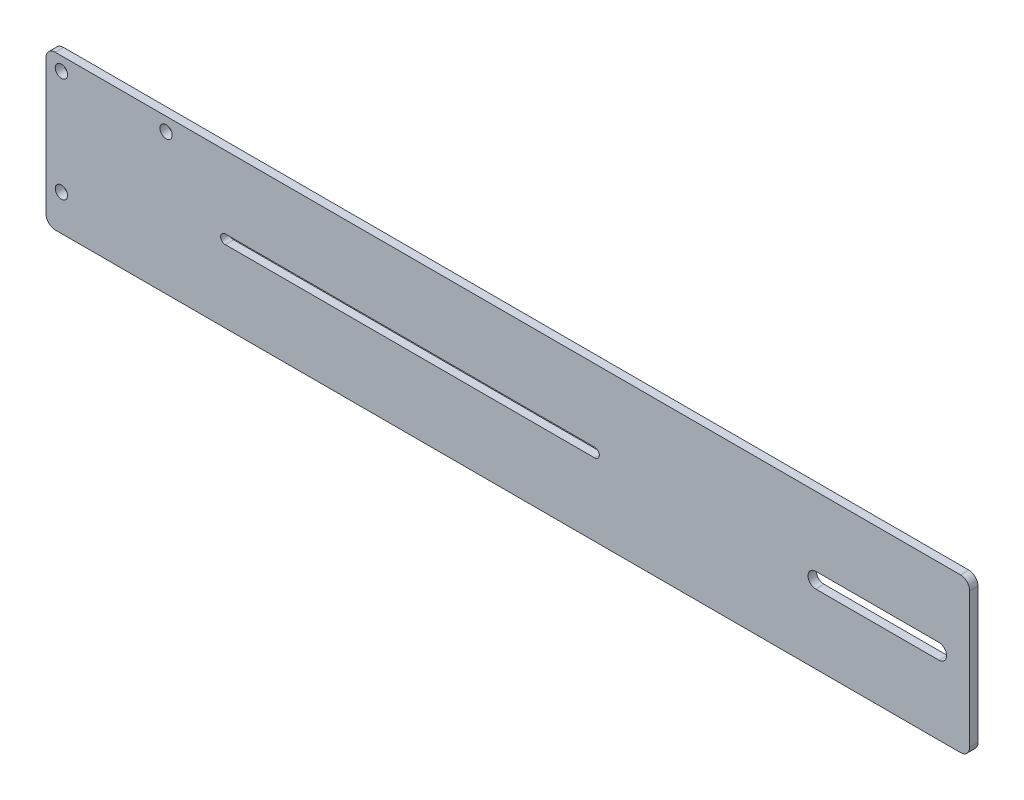
ISO-10303-21;
HEADER;
FILE_DESCRIPTION(('STEP AP214'),'2;1');
FILE_NAME('part.step','',(''),(''),'','','');
FILE_SCHEMA(('AUTOMOTIVE_DESIGN { 1 0 10303 214 1 1 1 1 }'));
ENDSEC;
DATA;
#1=APPLICATION_CONTEXT('core data for automotive mechanical design processes');
#2=APPLICATION_PROTOCOL_DEFINITION('international standard','automotive_design',2000,#1);
#3=PRODUCT_CONTEXT('',#1,'mechanical');
#4=PRODUCT('Part','Part','',(#3));
#5=PRODUCT_RELATED_PRODUCT_CATEGORY('part','',(#4));
#6=PRODUCT_DEFINITION_FORMATION('','',#4);
#7=PRODUCT_DEFINITION_CONTEXT('part definition',#1,'design');
#8=PRODUCT_DEFINITION('design','',#6,#7);
#9=PRODUCT_DEFINITION_SHAPE('','',#8);
#10=(LENGTH_UNIT() NAMED_UNIT(*) SI_UNIT(.MILLI.,.METRE.));
#11=(NAMED_UNIT(*) PLANE_ANGLE_UNIT() SI_UNIT($,.RADIAN.));
#12=(NAMED_UNIT(*) SI_UNIT($,.STERADIAN.) SOLID_ANGLE_UNIT());
#13=UNCERTAINTY_MEASURE_WITH_UNIT(LENGTH_MEASURE(1.E-05),#10,'distance_accuracy_value','');
#14=(GEOMETRIC_REPRESENTATION_CONTEXT(3) GLOBAL_UNCERTAINTY_ASSIGNED_CONTEXT((#13)) GLOBAL_UNIT_ASSIGNED_CONTEXT((#10,
#11,#12)) REPRESENTATION_CONTEXT('',''));
#15=CARTESIAN_POINT('',(0.,0.,0.));
#16=DIRECTION('',(0.,0.,1.));
#17=DIRECTION('',(1.,0.,0.));
#18=AXIS2_PLACEMENT_3D('',#15,#16,#17);
#19=CARTESIAN_POINT('',(3.,22.,2.7));
#20=DIRECTION('',(0.,0.,-1.));
#21=DIRECTION('',(-1.,0.,0.));
#22=AXIS2_PLACEMENT_3D('',#19,#20,#21);
#23=CYLINDRICAL_SURFACE('',#22,3.);
#24=CARTESIAN_POINT('',(3.,22.,0.));
#25=DIRECTION('',(0.,0.,1.));
#26=DIRECTION('',(1.,0.,0.));
#27=AXIS2_PLACEMENT_3D('',#24,#25,#26);
#28=CIRCLE('',#27,3.);
#29=CARTESIAN_POINT('',(0.,22.,0.));
#30=VERTEX_POINT('',#29);
#31=CARTESIAN_POINT('',(3.00000000000002,25.,0.));
#32=VERTEX_POINT('',#31);
#33=EDGE_CURVE('E222',#30,#32,#28,.F.);
#34=ORIENTED_EDGE('',*,*,#33,.F.);
#35=DIRECTION('',(0.,0.,-1.));
#36=VECTOR('',#35,1.);
#37=CARTESIAN_POINT('',(0.,22.,2.7));
#38=LINE('',#37,#36);
#39=CARTESIAN_POINT('',(0.,22.,2.7));
#40=VERTEX_POINT('',#39);
#41=EDGE_CURVE('E11',#40,#30,#38,.T.);
#42=ORIENTED_EDGE('',*,*,#41,.F.);
#43=CARTESIAN_POINT('',(3.,22.,2.7));
#44=DIRECTION('',(0.,0.,1.));
#45=DIRECTION('',(1.,0.,0.));
#46=AXIS2_PLACEMENT_3D('',#43,#44,#45);
#47=CIRCLE('',#46,3.);
#48=CARTESIAN_POINT('',(3.00000000000002,25.,2.7));
#49=VERTEX_POINT('',#48);
#50=EDGE_CURVE('E307',#40,#49,#47,.F.);
#51=ORIENTED_EDGE('',*,*,#50,.T.);
#52=DIRECTION('',(0.,0.,-1.));
#53=VECTOR('',#52,1.);
#54=CARTESIAN_POINT('',(3.00000000000002,25.,2.7));
#55=LINE('',#54,#53);
#56=EDGE_CURVE('E56',#49,#32,#55,.T.);
#57=ORIENTED_EDGE('',*,*,#56,.T.);
#58=EDGE_LOOP('',(#34,#42,#51,#57));
#59=FACE_BOUND('',#58,.T.);
#60=ADVANCED_FACE('F37',(#59),#23,.T.);
#61=CARTESIAN_POINT('',(0.,0.,2.7));
#62=DIRECTION('',(1.,0.,0.));
#63=DIRECTION('',(0.,1.,0.));
#64=AXIS2_PLACEMENT_3D('',#61,#62,#63);
#65=PLANE('',#64);
#66=DIRECTION('',(0.,-1.,0.));
#67=VECTOR('',#66,1.);
#68=CARTESIAN_POINT('',(0.,0.,0.));
#69=LINE('',#68,#67);
#70=CARTESIAN_POINT('',(0.,-22.,0.));
#71=VERTEX_POINT('',#70);
#72=EDGE_CURVE('E224',#30,#71,#69,.T.);
#73=ORIENTED_EDGE('',*,*,#72,.T.);
#74=DIRECTION('',(0.,0.,-1.));
#75=VECTOR('',#74,1.);
#76=CARTESIAN_POINT('',(0.,-22.,2.7));
#77=LINE('',#76,#75);
#78=CARTESIAN_POINT('',(0.,-22.,2.7));
#79=VERTEX_POINT('',#78);
#80=EDGE_CURVE('E47',#79,#71,#77,.T.);
#81=ORIENTED_EDGE('',*,*,#80,.F.);
#82=DIRECTION('',(0.,-1.,0.));
#83=VECTOR('',#82,1.);
#84=CARTESIAN_POINT('',(0.,0.,2.7));
#85=LINE('',#84,#83);
#86=EDGE_CURVE('E309',#40,#79,#85,.T.);
#87=ORIENTED_EDGE('',*,*,#86,.F.);
#88=ORIENTED_EDGE('',*,*,#41,.T.);
#89=EDGE_LOOP('',(#73,#81,#87,#88));
#90=FACE_BOUND('',#89,.T.);
#91=ADVANCED_FACE('F336',(#90),#65,.F.);
#92=CARTESIAN_POINT('',(3.00000000000001,-22.,2.7));
#93=DIRECTION('',(0.,0.,-1.));
#94=DIRECTION('',(-1.,0.,0.));
#95=AXIS2_PLACEMENT_3D('',#92,#93,#94);
#96=CYLINDRICAL_SURFACE('',#95,3.);
#97=CARTESIAN_POINT('',(3.00000000000001,-22.,0.));
#98=DIRECTION('',(0.,0.,1.));
#99=DIRECTION('',(1.,0.,0.));
#100=AXIS2_PLACEMENT_3D('',#97,#98,#99);
#101=CIRCLE('',#100,3.);
#102=CARTESIAN_POINT('',(3.00000000000003,-25.,0.));
#103=VERTEX_POINT('',#102);
#104=EDGE_CURVE('E227',#71,#103,#101,.T.);
#105=ORIENTED_EDGE('',*,*,#104,.T.);
#106=DIRECTION('',(0.,0.,-1.));
#107=VECTOR('',#106,1.);
#108=CARTESIAN_POINT('',(3.00000000000003,-25.,2.7));
#109=LINE('',#108,#107);
#110=CARTESIAN_POINT('',(3.00000000000003,-25.,2.7));
#111=VERTEX_POINT('',#110);
#112=EDGE_CURVE('E248',#111,#103,#109,.T.);
#113=ORIENTED_EDGE('',*,*,#112,.F.);
#114=CARTESIAN_POINT('',(3.00000000000001,-22.,2.7));
#115=DIRECTION('',(0.,0.,1.));
#116=DIRECTION('',(1.,0.,0.));
#117=AXIS2_PLACEMENT_3D('',#114,#115,#116);
#118=CIRCLE('',#117,3.);
#119=EDGE_CURVE('E312',#79,#111,#118,.T.);
#120=ORIENTED_EDGE('',*,*,#119,.F.);
#121=ORIENTED_EDGE('',*,*,#80,.T.);
#122=EDGE_LOOP('',(#105,#113,#120,#121));
#123=FACE_BOUND('',#122,.T.);
#124=ADVANCED_FACE('F341',(#123),#96,.T.);
#125=CARTESIAN_POINT('',(0.,-25.,2.7));
#126=DIRECTION('',(0.,1.,0.));
#127=DIRECTION('',(0.,0.,1.));
#128=AXIS2_PLACEMENT_3D('',#125,#126,#127);
#129=PLANE('',#128);
#130=DIRECTION('',(1.,0.,0.));
#131=VECTOR('',#130,1.);
#132=CARTESIAN_POINT('',(0.,-25.,0.));
#133=LINE('',#132,#131);
#134=CARTESIAN_POINT('',(297.,-25.,0.));
#135=VERTEX_POINT('',#134);
#136=EDGE_CURVE('E230',#103,#135,#133,.T.);
#137=ORIENTED_EDGE('',*,*,#136,.T.);
#138=DIRECTION('',(0.,0.,-1.));
#139=VECTOR('',#138,1.);
#140=CARTESIAN_POINT('',(297.,-25.,2.7));
#141=LINE('',#140,#139);
#142=CARTESIAN_POINT('',(297.,-25.,2.7));
#143=VERTEX_POINT('',#142);
#144=EDGE_CURVE('E246',#143,#135,#141,.T.);
#145=ORIENTED_EDGE('',*,*,#144,.F.);
#146=DIRECTION('',(1.,0.,0.));
#147=VECTOR('',#146,1.);
#148=CARTESIAN_POINT('',(0.,-25.,2.7));
#149=LINE('',#148,#147);
#150=EDGE_CURVE('E183',#111,#143,#149,.T.);
#151=ORIENTED_EDGE('',*,*,#150,.F.);
#152=ORIENTED_EDGE('',*,*,#112,.T.);
#153=EDGE_LOOP('',(#137,#145,#151,#152));
#154=FACE_BOUND('',#153,.T.);
#155=ADVANCED_FACE('F317',(#154),#129,.F.);
#156=CARTESIAN_POINT('',(297.,-22.,2.7));
#157=DIRECTION('',(0.,0.,-1.));
#158=DIRECTION('',(-1.,0.,0.));
#159=AXIS2_PLACEMENT_3D('',#156,#157,#158);
#160=CYLINDRICAL_SURFACE('',#159,3.);
#161=CARTESIAN_POINT('',(297.,-22.,0.));
#162=DIRECTION('',(0.,0.,1.));
#163=DIRECTION('',(1.,0.,0.));
#164=AXIS2_PLACEMENT_3D('',#161,#162,#163);
#165=CIRCLE('',#164,3.);
#166=CARTESIAN_POINT('',(300.,-22.,0.));
#167=VERTEX_POINT('',#166);
#168=EDGE_CURVE('E233',#167,#135,#165,.F.);
#169=ORIENTED_EDGE('',*,*,#168,.F.);
#170=DIRECTION('',(0.,0.,-1.));
#171=VECTOR('',#170,1.);
#172=CARTESIAN_POINT('',(300.,-22.,2.7));
#173=LINE('',#172,#171);
#174=CARTESIAN_POINT('',(300.,-22.,2.7));
#175=VERTEX_POINT('',#174);
#176=EDGE_CURVE('E169',#175,#167,#173,.T.);
#177=ORIENTED_EDGE('',*,*,#176,.F.);
#178=CARTESIAN_POINT('',(297.,-22.,2.7));
#179=DIRECTION('',(0.,0.,1.));
#180=DIRECTION('',(1.,0.,0.));
#181=AXIS2_PLACEMENT_3D('',#178,#179,#180);
#182=CIRCLE('',#181,3.);
#183=EDGE_CURVE('E181',#175,#143,#182,.F.);
#184=ORIENTED_EDGE('',*,*,#183,.T.);
#185=ORIENTED_EDGE('',*,*,#144,.T.);
#186=EDGE_LOOP('',(#169,#177,#184,#185));
#187=FACE_BOUND('',#186,.T.);
#188=ADVANCED_FACE('F320',(#187),#160,.T.);
#189=CARTESIAN_POINT('',(300.,0.,2.7));
#190=DIRECTION('',(1.,0.,0.));
#191=DIRECTION('',(0.,0.,-1.));
#192=AXIS2_PLACEMENT_3D('',#189,#190,#191);
#193=PLANE('',#192);
#194=DIRECTION('',(0.,-1.,0.));
#195=VECTOR('',#194,1.);
#196=CARTESIAN_POINT('',(300.,0.,0.));
#197=LINE('',#196,#195);
#198=CARTESIAN_POINT('',(300.,22.,0.));
#199=VERTEX_POINT('',#198);
#200=EDGE_CURVE('E166',#199,#167,#197,.T.);
#201=ORIENTED_EDGE('',*,*,#200,.F.);
#202=DIRECTION('',(0.,0.,-1.));
#203=VECTOR('',#202,1.);
#204=CARTESIAN_POINT('',(300.,22.,2.7));
#205=LINE('',#204,#203);
#206=CARTESIAN_POINT('',(300.,22.,2.7));
#207=VERTEX_POINT('',#206);
#208=EDGE_CURVE('E160',#207,#199,#205,.T.);
#209=ORIENTED_EDGE('',*,*,#208,.F.);
#210=DIRECTION('',(0.,-1.,0.));
#211=VECTOR('',#210,1.);
#212=CARTESIAN_POINT('',(300.,0.,2.7));
#213=LINE('',#212,#211);
#214=EDGE_CURVE('E164',#207,#175,#213,.T.);
#215=ORIENTED_EDGE('',*,*,#214,.T.);
#216=ORIENTED_EDGE('',*,*,#176,.T.);
#217=EDGE_LOOP('',(#201,#209,#215,#216));
#218=FACE_BOUND('',#217,.T.);
#219=ADVANCED_FACE('F162',(#218),#193,.T.);
#220=CARTESIAN_POINT('',(297.,22.,2.7));
#221=DIRECTION('',(0.,0.,-1.));
#222=DIRECTION('',(-1.,0.,0.));
#223=AXIS2_PLACEMENT_3D('',#220,#221,#222);
#224=CYLINDRICAL_SURFACE('',#223,3.);
#225=CARTESIAN_POINT('',(297.,22.,0.));
#226=DIRECTION('',(0.,0.,1.));
#227=DIRECTION('',(1.,0.,0.));
#228=AXIS2_PLACEMENT_3D('',#225,#226,#227);
#229=CIRCLE('',#228,3.);
#230=CARTESIAN_POINT('',(297.,25.,0.));
#231=VERTEX_POINT('',#230);
#232=EDGE_CURVE('E237',#199,#231,#229,.T.);
#233=ORIENTED_EDGE('',*,*,#232,.T.);
#234=DIRECTION('',(0.,0.,-1.));
#235=VECTOR('',#234,1.);
#236=CARTESIAN_POINT('',(297.,25.,2.7));
#237=LINE('',#236,#235);
#238=CARTESIAN_POINT('',(297.,25.,2.7));
#239=VERTEX_POINT('',#238);
#240=EDGE_CURVE('E106',#239,#231,#237,.T.);
#241=ORIENTED_EDGE('',*,*,#240,.F.);
#242=CARTESIAN_POINT('',(297.,22.,2.7));
#243=DIRECTION('',(0.,0.,1.));
#244=DIRECTION('',(1.,0.,0.));
#245=AXIS2_PLACEMENT_3D('',#242,#243,#244);
#246=CIRCLE('',#245,3.);
#247=EDGE_CURVE('E171',#207,#239,#246,.T.);
#248=ORIENTED_EDGE('',*,*,#247,.F.);
#249=ORIENTED_EDGE('',*,*,#208,.T.);
#250=EDGE_LOOP('',(#233,#241,#248,#249));
#251=FACE_BOUND('',#250,.T.);
#252=ADVANCED_FACE('F172',(#251),#224,.T.);
#253=CARTESIAN_POINT('',(0.,-2.49999999999999,2.7));
#254=DIRECTION('',(0.,-1.,0.));
#255=DIRECTION('',(1.,0.,0.));
#256=AXIS2_PLACEMENT_3D('',#253,#254,#255);
#257=PLANE('',#256);
#258=DIRECTION('',(-1.,0.,0.));
#259=VECTOR('',#258,1.);
#260=CARTESIAN_POINT('',(0.,-2.49999999999999,0.));
#261=LINE('',#260,#259);
#262=CARTESIAN_POINT('',(290.,-2.5,0.));
#263=VERTEX_POINT('',#262);
#264=CARTESIAN_POINT('',(250.,-2.5,0.));
#265=VERTEX_POINT('',#264);
#266=EDGE_CURVE('E201',#263,#265,#261,.T.);
#267=ORIENTED_EDGE('',*,*,#266,.T.);
#268=DIRECTION('',(0.,0.,-1.));
#269=VECTOR('',#268,1.);
#270=CARTESIAN_POINT('',(250.,-2.5,2.7));
#271=LINE('',#270,#269);
#272=CARTESIAN_POINT('',(250.,-2.5,2.7));
#273=VERTEX_POINT('',#272);
#274=EDGE_CURVE('E243',#273,#265,#271,.T.);
#275=ORIENTED_EDGE('',*,*,#274,.F.);
#276=DIRECTION('',(-1.,0.,0.));
#277=VECTOR('',#276,1.);
#278=CARTESIAN_POINT('',(0.,-2.49999999999999,2.7));
#279=LINE('',#278,#277);
#280=CARTESIAN_POINT('',(290.,-2.5,2.7));
#281=VERTEX_POINT('',#280);
#282=EDGE_CURVE('E284',#281,#273,#279,.T.);
#283=ORIENTED_EDGE('',*,*,#282,.F.);
#284=DIRECTION('',(0.,0.,-1.));
#285=VECTOR('',#284,1.);
#286=CARTESIAN_POINT('',(290.,-2.5,2.7));
#287=LINE('',#286,#285);
#288=EDGE_CURVE('E253',#281,#263,#287,.T.);
#289=ORIENTED_EDGE('',*,*,#288,.T.);
#290=EDGE_LOOP('',(#267,#275,#283,#289));
#291=FACE_BOUND('',#290,.T.);
#292=ADVANCED_FACE('F368',(#291),#257,.F.);
#293=CARTESIAN_POINT('',(250.,0.,2.7));
#294=DIRECTION('',(0.,0.,-1.));
#295=DIRECTION('',(-1.,0.,0.));
#296=AXIS2_PLACEMENT_3D('',#293,#294,#295);
#297=CYLINDRICAL_SURFACE('',#296,2.5);
#298=CARTESIAN_POINT('',(250.,0.,0.));
#299=DIRECTION('',(0.,0.,1.));
#300=DIRECTION('',(1.,0.,0.));
#301=AXIS2_PLACEMENT_3D('',#298,#299,#300);
#302=CIRCLE('',#301,2.5);
#303=CARTESIAN_POINT('',(250.,2.5,0.));
#304=VERTEX_POINT('',#303);
#305=EDGE_CURVE('E204',#304,#265,#302,.T.);
#306=ORIENTED_EDGE('',*,*,#305,.F.);
#307=DIRECTION('',(0.,0.,-1.));
#308=VECTOR('',#307,1.);
#309=CARTESIAN_POINT('',(250.,2.5,2.7));
#310=LINE('',#309,#308);
#311=CARTESIAN_POINT('',(250.,2.5,2.7));
#312=VERTEX_POINT('',#311);
#313=EDGE_CURVE('E257',#312,#304,#310,.T.);
#314=ORIENTED_EDGE('',*,*,#313,.F.);
#315=CARTESIAN_POINT('',(250.,0.,2.7));
#316=DIRECTION('',(0.,0.,1.));
#317=DIRECTION('',(1.,0.,0.));
#318=AXIS2_PLACEMENT_3D('',#315,#316,#317);
#319=CIRCLE('',#318,2.5);
#320=EDGE_CURVE('E286',#312,#273,#319,.T.);
#321=ORIENTED_EDGE('',*,*,#320,.T.);
#322=ORIENTED_EDGE('',*,*,#274,.T.);
#323=EDGE_LOOP('',(#306,#314,#321,#322));
#324=FACE_BOUND('',#323,.T.);
#325=ADVANCED_FACE('F364',(#324),#297,.F.);
#326=CARTESIAN_POINT('',(0.,2.5,2.7));
#327=DIRECTION('',(0.,1.,0.));
#328=DIRECTION('',(0.,0.,1.));
#329=AXIS2_PLACEMENT_3D('',#326,#327,#328);
#330=PLANE('',#329);
#331=DIRECTION('',(1.,0.,0.));
#332=VECTOR('',#331,1.);
#333=CARTESIAN_POINT('',(0.,2.5,0.));
#334=LINE('',#333,#332);
#335=CARTESIAN_POINT('',(290.,2.5,0.));
#336=VERTEX_POINT('',#335);
#337=EDGE_CURVE('E207',#304,#336,#334,.T.);
#338=ORIENTED_EDGE('',*,*,#337,.T.);
#339=DIRECTION('',(0.,0.,-1.));
#340=VECTOR('',#339,1.);
#341=CARTESIAN_POINT('',(290.,2.5,2.7));
#342=LINE('',#341,#340);
#343=CARTESIAN_POINT('',(290.,2.5,2.7));
#344=VERTEX_POINT('',#343);
#345=EDGE_CURVE('E255',#344,#336,#342,.T.);
#346=ORIENTED_EDGE('',*,*,#345,.F.);
#347=DIRECTION('',(1.,0.,0.));
#348=VECTOR('',#347,1.);
#349=CARTESIAN_POINT('',(0.,2.5,2.7));
#350=LINE('',#349,#348);
#351=EDGE_CURVE('E293',#312,#344,#350,.T.);
#352=ORIENTED_EDGE('',*,*,#351,.F.);
#353=ORIENTED_EDGE('',*,*,#313,.T.);
#354=EDGE_LOOP('',(#338,#346,#352,#353));
#355=FACE_BOUND('',#354,.T.);
#356=ADVANCED_FACE('F361',(#355),#330,.F.);
#357=CARTESIAN_POINT('',(0.,-1.5,2.7));
#358=DIRECTION('',(0.,-1.,0.));
#359=DIRECTION('',(0.,0.,-1.));
#360=AXIS2_PLACEMENT_3D('',#357,#358,#359);
#361=PLANE('',#360);
#362=DIRECTION('',(-1.,0.,0.));
#363=VECTOR('',#362,1.);
#364=CARTESIAN_POINT('',(0.,-1.5,0.));
#365=LINE('',#364,#363);
#366=CARTESIAN_POINT('',(178.219392867782,-1.5,0.));
#367=VERTEX_POINT('',#366);
#368=CARTESIAN_POINT('',(58.2193928677821,-1.5,0.));
#369=VERTEX_POINT('',#368);
#370=EDGE_CURVE('E189',#367,#369,#365,.T.);
#371=ORIENTED_EDGE('',*,*,#370,.T.);
#372=DIRECTION('',(0.,0.,-1.));
#373=VECTOR('',#372,1.);
#374=CARTESIAN_POINT('',(58.2193928677821,-1.5,2.7));
#375=LINE('',#374,#373);
#376=CARTESIAN_POINT('',(58.2193928677821,-1.5,2.7));
#377=VERTEX_POINT('',#376);
#378=EDGE_CURVE('E41',#377,#369,#375,.T.);
#379=ORIENTED_EDGE('',*,*,#378,.F.);
#380=DIRECTION('',(-1.,0.,0.));
#381=VECTOR('',#380,1.);
#382=CARTESIAN_POINT('',(0.,-1.5,2.7));
#383=LINE('',#382,#381);
#384=CARTESIAN_POINT('',(178.219392867782,-1.5,2.7));
#385=VERTEX_POINT('',#384);
#386=EDGE_CURVE('E119',#385,#377,#383,.T.);
#387=ORIENTED_EDGE('',*,*,#386,.F.);
#388=DIRECTION('',(0.,0.,-1.));
#389=VECTOR('',#388,1.);
#390=CARTESIAN_POINT('',(178.219392867782,-1.5,2.7));
#391=LINE('',#390,#389);
#392=EDGE_CURVE('E188',#385,#367,#391,.T.);
#393=ORIENTED_EDGE('',*,*,#392,.T.);
#394=EDGE_LOOP('',(#371,#379,#387,#393));
#395=FACE_BOUND('',#394,.T.);
#396=ADVANCED_FACE('F39',(#395),#361,.F.);
#397=CARTESIAN_POINT('',(58.2193928677821,0.,2.7));
#398=DIRECTION('',(0.,0.,-1.));
#399=DIRECTION('',(-1.,0.,0.));
#400=AXIS2_PLACEMENT_3D('',#397,#398,#399);
#401=CYLINDRICAL_SURFACE('',#400,1.5);
#402=CARTESIAN_POINT('',(58.2193928677821,0.,0.));
#403=DIRECTION('',(0.,0.,1.));
#404=DIRECTION('',(1.,0.,0.));
#405=AXIS2_PLACEMENT_3D('',#402,#403,#404);
#406=CIRCLE('',#405,1.5);
#407=CARTESIAN_POINT('',(58.2193928677821,1.5,0.));
#408=VERTEX_POINT('',#407);
#409=EDGE_CURVE('E192',#408,#369,#406,.T.);
#410=ORIENTED_EDGE('',*,*,#409,.F.);
#411=DIRECTION('',(0.,0.,-1.));
#412=VECTOR('',#411,1.);
#413=CARTESIAN_POINT('',(58.2193928677821,1.5,2.7));
#414=LINE('',#413,#412);
#415=CARTESIAN_POINT('',(58.2193928677821,1.5,2.7));
#416=VERTEX_POINT('',#415);
#417=EDGE_CURVE('E262',#416,#408,#414,.T.);
#418=ORIENTED_EDGE('',*,*,#417,.F.);
#419=CARTESIAN_POINT('',(58.2193928677821,0.,2.7));
#420=DIRECTION('',(0.,0.,1.));
#421=DIRECTION('',(1.,0.,0.));
#422=AXIS2_PLACEMENT_3D('',#419,#420,#421);
#423=CIRCLE('',#422,1.5);
#424=EDGE_CURVE('E270',#416,#377,#423,.T.);
#425=ORIENTED_EDGE('',*,*,#424,.T.);
#426=ORIENTED_EDGE('',*,*,#378,.T.);
#427=EDGE_LOOP('',(#410,#418,#425,#426));
#428=FACE_BOUND('',#427,.T.);
#429=ADVANCED_FACE('F269',(#428),#401,.F.);
#430=CARTESIAN_POINT('',(0.,1.5,2.7));
#431=DIRECTION('',(0.,1.,0.));
#432=DIRECTION('',(0.,0.,1.));
#433=AXIS2_PLACEMENT_3D('',#430,#431,#432);
#434=PLANE('',#433);
#435=DIRECTION('',(1.,0.,0.));
#436=VECTOR('',#435,1.);
#437=CARTESIAN_POINT('',(0.,1.5,0.));
#438=LINE('',#437,#436);
#439=CARTESIAN_POINT('',(178.219392867782,1.5,0.));
#440=VERTEX_POINT('',#439);
#441=EDGE_CURVE('E195',#408,#440,#438,.T.);
#442=ORIENTED_EDGE('',*,*,#441,.T.);
#443=DIRECTION('',(0.,0.,-1.));
#444=VECTOR('',#443,1.);
#445=CARTESIAN_POINT('',(178.219392867782,1.5,2.7));
#446=LINE('',#445,#444);
#447=CARTESIAN_POINT('',(178.219392867782,1.5,2.7));
#448=VERTEX_POINT('',#447);
#449=EDGE_CURVE('E261',#448,#440,#446,.T.);
#450=ORIENTED_EDGE('',*,*,#449,.F.);
#451=DIRECTION('',(1.,0.,0.));
#452=VECTOR('',#451,1.);
#453=CARTESIAN_POINT('',(0.,1.5,2.7));
#454=LINE('',#453,#452);
#455=EDGE_CURVE('E280',#416,#448,#454,.T.);
#456=ORIENTED_EDGE('',*,*,#455,.F.);
#457=ORIENTED_EDGE('',*,*,#417,.T.);
#458=EDGE_LOOP('',(#442,#450,#456,#457));
#459=FACE_BOUND('',#458,.T.);
#460=ADVANCED_FACE('F278',(#459),#434,.F.);
#461=CARTESIAN_POINT('',(5.,20.65,2.7));
#462=DIRECTION('',(0.,0.,-1.));
#463=DIRECTION('',(-1.,0.,0.));
#464=AXIS2_PLACEMENT_3D('',#461,#462,#463);
#465=CYLINDRICAL_SURFACE('',#464,2.);
#466=CARTESIAN_POINT('',(5.,20.65,2.7));
#467=DIRECTION('',(0.,0.,1.));
#468=DIRECTION('',(1.,0.,0.));
#469=AXIS2_PLACEMENT_3D('',#466,#467,#468);
#470=CIRCLE('',#469,2.);
#471=CARTESIAN_POINT('',(3.,20.65,2.7));
#472=VERTEX_POINT('',#471);
#473=EDGE_CURVE('E304',#472,#472,#470,.T.);
#474=CARTESIAN_POINT('',(5.,20.65,0.));
#475=DIRECTION('',(0.,0.,1.));
#476=DIRECTION('',(1.,0.,0.));
#477=AXIS2_PLACEMENT_3D('',#474,#475,#476);
#478=CIRCLE('',#477,2.);
#479=CARTESIAN_POINT('',(3.,20.65,0.));
#480=VERTEX_POINT('',#479);
#481=EDGE_CURVE('E219',#480,#480,#478,.T.);
#482=CARTESIAN_POINT('',(3.,20.65,2.7));
#483=CARTESIAN_POINT('',(3.,20.65,2.671875));
#484=CARTESIAN_POINT('',(3.,20.65,2.64375));
#485=CARTESIAN_POINT('',(3.,20.65,2.5875));
#486=CARTESIAN_POINT('',(3.,20.65,2.559375));
#487=CARTESIAN_POINT('',(3.,20.65,2.503125));
#488=CARTESIAN_POINT('',(3.,20.65,2.475));
#489=CARTESIAN_POINT('',(3.,20.65,2.41875));
#490=CARTESIAN_POINT('',(3.,20.65,2.390625));
#491=CARTESIAN_POINT('',(3.,20.65,2.334375));
#492=CARTESIAN_POINT('',(3.,20.65,2.30625));
#493=CARTESIAN_POINT('',(3.,20.65,2.25));
#494=CARTESIAN_POINT('',(3.,20.65,2.221875));
#495=CARTESIAN_POINT('',(3.,20.65,2.165625));
#496=CARTESIAN_POINT('',(3.,20.65,2.1375));
#497=CARTESIAN_POINT('',(3.,20.65,2.08125));
#498=CARTESIAN_POINT('',(3.,20.65,2.053125));
#499=CARTESIAN_POINT('',(3.,20.65,1.996875));
#500=CARTESIAN_POINT('',(3.,20.65,1.96875));
#501=CARTESIAN_POINT('',(3.,20.65,1.9125));
#502=CARTESIAN_POINT('',(3.,20.65,1.884375));
#503=CARTESIAN_POINT('',(3.,20.65,1.828125));
#504=CARTESIAN_POINT('',(3.,20.65,1.8));
#505=CARTESIAN_POINT('',(3.,20.65,1.74375));
#506=CARTESIAN_POINT('',(3.,20.65,1.715625));
#507=CARTESIAN_POINT('',(3.,20.65,1.659375));
#508=CARTESIAN_POINT('',(3.,20.65,1.63125));
#509=CARTESIAN_POINT('',(3.,20.65,1.575));
#510=CARTESIAN_POINT('',(3.,20.65,1.546875));
#511=CARTESIAN_POINT('',(3.,20.65,1.490625));
#512=CARTESIAN_POINT('',(3.,20.65,1.4625));
#513=CARTESIAN_POINT('',(3.,20.65,1.40625));
#514=CARTESIAN_POINT('',(3.,20.65,1.378125));
#515=CARTESIAN_POINT('',(3.,20.65,1.321875));
#516=CARTESIAN_POINT('',(3.,20.65,1.29375));
#517=CARTESIAN_POINT('',(3.,20.65,1.2375));
#518=CARTESIAN_POINT('',(3.,20.65,1.209375));
#519=CARTESIAN_POINT('',(3.,20.65,1.153125));
#520=CARTESIAN_POINT('',(3.,20.65,1.125));
#521=CARTESIAN_POINT('',(3.,20.65,1.06875));
#522=CARTESIAN_POINT('',(3.,20.65,1.040625));
#523=CARTESIAN_POINT('',(3.,20.65,0.984375));
#524=CARTESIAN_POINT('',(3.,20.65,0.956249999999999));
#525=CARTESIAN_POINT('',(3.,20.65,0.899999999999999));
#526=CARTESIAN_POINT('',(3.,20.65,0.871875));
#527=CARTESIAN_POINT('',(3.,20.65,0.815624999999999));
#528=CARTESIAN_POINT('',(3.,20.65,0.787499999999999));
#529=CARTESIAN_POINT('',(3.,20.65,0.73125));
#530=CARTESIAN_POINT('',(3.,20.65,0.703125));
#531=CARTESIAN_POINT('',(3.,20.65,0.646875));
#532=CARTESIAN_POINT('',(3.,20.65,0.61875));
#533=CARTESIAN_POINT('',(3.,20.65,0.5625));
#534=CARTESIAN_POINT('',(3.,20.65,0.534375));
#535=CARTESIAN_POINT('',(3.,20.65,0.478125));
#536=CARTESIAN_POINT('',(3.,20.65,0.45));
#537=CARTESIAN_POINT('',(3.,20.65,0.39375));
#538=CARTESIAN_POINT('',(3.,20.65,0.365625));
#539=CARTESIAN_POINT('',(3.,20.65,0.309375));
#540=CARTESIAN_POINT('',(3.,20.65,0.28125));
#541=CARTESIAN_POINT('',(3.,20.65,0.225));
#542=CARTESIAN_POINT('',(3.,20.65,0.196875));
#543=CARTESIAN_POINT('',(3.,20.65,0.140625));
#544=CARTESIAN_POINT('',(3.,20.65,0.1125));
#545=CARTESIAN_POINT('',(3.,20.65,0.0562499999999997));
#546=CARTESIAN_POINT('',(3.,20.65,0.0281249999999996));
#547=CARTESIAN_POINT('',(3.,20.65,0.));
#548=B_SPLINE_CURVE_WITH_KNOTS('',3,(#482,#483,#484,#485,#486,#487,#488,#489,#490,#491,#492,
#493,#494,#495,#496,#497,#498,#499,#500,#501,#502,#503,#504,#505,#506,#507,#508,#509,#510,#511,
#512,#513,#514,#515,#516,#517,#518,#519,#520,#521,#522,#523,#524,#525,#526,#527,#528,#529,#530,
#531,#532,#533,#534,#535,#536,#537,#538,#539,#540,#541,#542,#543,#544,#545,#546,#547),
.UNSPECIFIED.,.F.,.F.,(4,2,2,2,2,2,2,2,2,2,2,2,2,2,2,2,2,2,2,2,2,2,2,2,2,2,2,2,2,2,2,2,4),(0.,
0.0843750000000003,0.16875,0.253125,0.3375,0.421875,0.50625,0.590625,0.675,0.759375,0.84375,
0.928125000000001,1.0125,1.096875,1.18125,1.265625,1.35,1.434375,1.51875,1.603125,1.6875,
1.771875,1.85625,1.940625,2.025,2.109375,2.19375,2.278125,2.3625,2.446875,2.53125,2.615625,2.7),.UNSPECIFIED.);
#549=EDGE_CURVE('BSEAM346',#472,#480,#548,.T.);
#550=ORIENTED_EDGE('',*,*,#473,.T.);
#551=ORIENTED_EDGE('',*,*,#481,.F.);
#552=ORIENTED_EDGE('',*,*,#549,.T.);
#553=ORIENTED_EDGE('',*,*,#549,.F.);
#554=EDGE_LOOP('',(#550,#552,#551,#553));
#555=FACE_BOUND('',#554,.T.);
#556=ADVANCED_FACE('F346',(#555),#465,.F.);
#557=CARTESIAN_POINT('',(39.,20.65,2.7));
#558=DIRECTION('',(0.,0.,-1.));
#559=DIRECTION('',(-1.,0.,0.));
#560=AXIS2_PLACEMENT_3D('',#557,#558,#559);
#561=CYLINDRICAL_SURFACE('',#560,2.);
#562=CARTESIAN_POINT('',(39.,20.65,2.7));
#563=DIRECTION('',(0.,0.,1.));
#564=DIRECTION('',(1.,0.,0.));
#565=AXIS2_PLACEMENT_3D('',#562,#563,#564);
#566=CIRCLE('',#565,2.);
#567=CARTESIAN_POINT('',(37.,20.65,2.7));
#568=VERTEX_POINT('',#567);
#569=EDGE_CURVE('E301',#568,#568,#566,.T.);
#570=CARTESIAN_POINT('',(39.,20.65,0.));
#571=DIRECTION('',(0.,0.,1.));
#572=DIRECTION('',(1.,0.,0.));
#573=AXIS2_PLACEMENT_3D('',#570,#571,#572);
#574=CIRCLE('',#573,2.);
#575=CARTESIAN_POINT('',(37.,20.65,0.));
#576=VERTEX_POINT('',#575);
#577=EDGE_CURVE('E216',#576,#576,#574,.T.);
#578=CARTESIAN_POINT('',(37.,20.65,2.7));
#579=CARTESIAN_POINT('',(37.,20.65,2.671875));
#580=CARTESIAN_POINT('',(37.,20.65,2.64375));
#581=CARTESIAN_POINT('',(37.,20.65,2.5875));
#582=CARTESIAN_POINT('',(37.,20.65,2.559375));
#583=CARTESIAN_POINT('',(37.,20.65,2.503125));
#584=CARTESIAN_POINT('',(37.,20.65,2.475));
#585=CARTESIAN_POINT('',(37.,20.65,2.41875));
#586=CARTESIAN_POINT('',(37.,20.65,2.390625));
#587=CARTESIAN_POINT('',(37.,20.65,2.334375));
#588=CARTESIAN_POINT('',(37.,20.65,2.30625));
#589=CARTESIAN_POINT('',(37.,20.65,2.25));
#590=CARTESIAN_POINT('',(37.,20.65,2.221875));
#591=CARTESIAN_POINT('',(37.,20.65,2.165625));
#592=CARTESIAN_POINT('',(37.,20.65,2.1375));
#593=CARTESIAN_POINT('',(37.,20.65,2.08125));
#594=CARTESIAN_POINT('',(37.,20.65,2.053125));
#595=CARTESIAN_POINT('',(37.,20.65,1.996875));
#596=CARTESIAN_POINT('',(37.,20.65,1.96875));
#597=CARTESIAN_POINT('',(37.,20.65,1.9125));
#598=CARTESIAN_POINT('',(37.,20.65,1.884375));
#599=CARTESIAN_POINT('',(37.,20.65,1.828125));
#600=CARTESIAN_POINT('',(37.,20.65,1.8));
#601=CARTESIAN_POINT('',(37.,20.65,1.74375));
#602=CARTESIAN_POINT('',(37.,20.65,1.715625));
#603=CARTESIAN_POINT('',(37.,20.65,1.659375));
#604=CARTESIAN_POINT('',(37.,20.65,1.63125));
#605=CARTESIAN_POINT('',(37.,20.65,1.575));
#606=CARTESIAN_POINT('',(37.,20.65,1.546875));
#607=CARTESIAN_POINT('',(37.,20.65,1.490625));
#608=CARTESIAN_POINT('',(37.,20.65,1.4625));
#609=CARTESIAN_POINT('',(37.,20.65,1.40625));
#610=CARTESIAN_POINT('',(37.,20.65,1.378125));
#611=CARTESIAN_POINT('',(37.,20.65,1.321875));
#612=CARTESIAN_POINT('',(37.,20.65,1.29375));
#613=CARTESIAN_POINT('',(37.,20.65,1.2375));
#614=CARTESIAN_POINT('',(37.,20.65,1.209375));
#615=CARTESIAN_POINT('',(37.,20.65,1.153125));
#616=CARTESIAN_POINT('',(37.,20.65,1.125));
#617=CARTESIAN_POINT('',(37.,20.65,1.06875));
#618=CARTESIAN_POINT('',(37.,20.65,1.040625));
#619=CARTESIAN_POINT('',(37.,20.65,0.984375));
#620=CARTESIAN_POINT('',(37.,20.65,0.956249999999999));
#621=CARTESIAN_POINT('',(37.,20.65,0.899999999999999));
#622=CARTESIAN_POINT('',(37.,20.65,0.871875));
#623=CARTESIAN_POINT('',(37.,20.65,0.815624999999999));
#624=CARTESIAN_POINT('',(37.,20.65,0.787499999999999));
#625=CARTESIAN_POINT('',(37.,20.65,0.73125));
#626=CARTESIAN_POINT('',(37.,20.65,0.703125));
#627=CARTESIAN_POINT('',(37.,20.65,0.646875));
#628=CARTESIAN_POINT('',(37.,20.65,0.61875));
#629=CARTESIAN_POINT('',(37.,20.65,0.5625));
#630=CARTESIAN_POINT('',(37.,20.65,0.534375));
#631=CARTESIAN_POINT('',(37.,20.65,0.478125));
#632=CARTESIAN_POINT('',(37.,20.65,0.45));
#633=CARTESIAN_POINT('',(37.,20.65,0.39375));
#634=CARTESIAN_POINT('',(37.,20.65,0.365625));
#635=CARTESIAN_POINT('',(37.,20.65,0.309375));
#636=CARTESIAN_POINT('',(37.,20.65,0.28125));
#637=CARTESIAN_POINT('',(37.,20.65,0.225));
#638=CARTESIAN_POINT('',(37.,20.65,0.196875));
#639=CARTESIAN_POINT('',(37.,20.65,0.140625));
#640=CARTESIAN_POINT('',(37.,20.65,0.1125));
#641=CARTESIAN_POINT('',(37.,20.65,0.0562499999999997));
#642=CARTESIAN_POINT('',(37.,20.65,0.0281249999999996));
#643=CARTESIAN_POINT('',(37.,20.65,0.));
#644=B_SPLINE_CURVE_WITH_KNOTS('',3,(#578,#579,#580,#581,#582,#583,#584,#585,#586,#587,#588,
#589,#590,#591,#592,#593,#594,#595,#596,#597,#598,#599,#600,#601,#602,#603,#604,#605,#606,#607,
#608,#609,#610,#611,#612,#613,#614,#615,#616,#617,#618,#619,#620,#621,#622,#623,#624,#625,#626,
#627,#628,#629,#630,#631,#632,#633,#634,#635,#636,#637,#638,#639,#640,#641,#642,#643),
.UNSPECIFIED.,.F.,.F.,(4,2,2,2,2,2,2,2,2,2,2,2,2,2,2,2,2,2,2,2,2,2,2,2,2,2,2,2,2,2,2,2,4),(0.,
0.0843750000000003,0.16875,0.253125,0.3375,0.421875,0.50625,0.590625,0.675,0.759375,0.84375,
0.928125000000001,1.0125,1.096875,1.18125,1.265625,1.35,1.434375,1.51875,1.603125,1.6875,
1.771875,1.85625,1.940625,2.025,2.109375,2.19375,2.278125,2.3625,2.446875,2.53125,2.615625,2.7),.UNSPECIFIED.);
#645=EDGE_CURVE('BSEAM349',#568,#576,#644,.T.);
#646=ORIENTED_EDGE('',*,*,#569,.T.);
#647=ORIENTED_EDGE('',*,*,#577,.F.);
#648=ORIENTED_EDGE('',*,*,#645,.T.);
#649=ORIENTED_EDGE('',*,*,#645,.F.);
#650=EDGE_LOOP('',(#646,#648,#647,#649));
#651=FACE_BOUND('',#650,.T.);
#652=ADVANCED_FACE('F349',(#651),#561,.F.);
#653=CARTESIAN_POINT('',(5.00000000000001,-13.35,2.7));
#654=DIRECTION('',(0.,0.,-1.));
#655=DIRECTION('',(-1.,0.,0.));
#656=AXIS2_PLACEMENT_3D('',#653,#654,#655);
#657=CYLINDRICAL_SURFACE('',#656,2.);
#658=CARTESIAN_POINT('',(5.00000000000001,-13.35,2.7));
#659=DIRECTION('',(0.,0.,1.));
#660=DIRECTION('',(1.,0.,0.));
#661=AXIS2_PLACEMENT_3D('',#658,#659,#660);
#662=CIRCLE('',#661,2.);
#663=CARTESIAN_POINT('',(3.00000000000001,-13.35,2.7));
#664=VERTEX_POINT('',#663);
#665=EDGE_CURVE('E298',#664,#664,#662,.T.);
#666=CARTESIAN_POINT('',(5.00000000000001,-13.35,0.));
#667=DIRECTION('',(0.,0.,1.));
#668=DIRECTION('',(1.,0.,0.));
#669=AXIS2_PLACEMENT_3D('',#666,#667,#668);
#670=CIRCLE('',#669,2.);
#671=CARTESIAN_POINT('',(3.00000000000001,-13.35,0.));
#672=VERTEX_POINT('',#671);
#673=EDGE_CURVE('E213',#672,#672,#670,.T.);
#674=CARTESIAN_POINT('',(3.00000000000001,-13.35,2.7));
#675=CARTESIAN_POINT('',(3.00000000000001,-13.35,2.671875));
#676=CARTESIAN_POINT('',(3.00000000000001,-13.35,2.64375));
#677=CARTESIAN_POINT('',(3.00000000000001,-13.35,2.5875));
#678=CARTESIAN_POINT('',(3.00000000000001,-13.35,2.559375));
#679=CARTESIAN_POINT('',(3.00000000000001,-13.35,2.503125));
#680=CARTESIAN_POINT('',(3.00000000000001,-13.35,2.475));
#681=CARTESIAN_POINT('',(3.00000000000001,-13.35,2.41875));
#682=CARTESIAN_POINT('',(3.00000000000001,-13.35,2.390625));
#683=CARTESIAN_POINT('',(3.00000000000001,-13.35,2.334375));
#684=CARTESIAN_POINT('',(3.00000000000001,-13.35,2.30625));
#685=CARTESIAN_POINT('',(3.00000000000001,-13.35,2.25));
#686=CARTESIAN_POINT('',(3.00000000000001,-13.35,2.221875));
#687=CARTESIAN_POINT('',(3.00000000000001,-13.35,2.165625));
#688=CARTESIAN_POINT('',(3.00000000000001,-13.35,2.1375));
#689=CARTESIAN_POINT('',(3.00000000000001,-13.35,2.08125));
#690=CARTESIAN_POINT('',(3.00000000000001,-13.35,2.053125));
#691=CARTESIAN_POINT('',(3.00000000000001,-13.35,1.996875));
#692=CARTESIAN_POINT('',(3.00000000000001,-13.35,1.96875));
#693=CARTESIAN_POINT('',(3.00000000000001,-13.35,1.9125));
#694=CARTESIAN_POINT('',(3.00000000000001,-13.35,1.884375));
#695=CARTESIAN_POINT('',(3.00000000000001,-13.35,1.828125));
#696=CARTESIAN_POINT('',(3.00000000000001,-13.35,1.8));
#697=CARTESIAN_POINT('',(3.00000000000001,-13.35,1.74375));
#698=CARTESIAN_POINT('',(3.00000000000001,-13.35,1.715625));
#699=CARTESIAN_POINT('',(3.00000000000001,-13.35,1.659375));
#700=CARTESIAN_POINT('',(3.00000000000001,-13.35,1.63125));
#701=CARTESIAN_POINT('',(3.00000000000001,-13.35,1.575));
#702=CARTESIAN_POINT('',(3.00000000000001,-13.35,1.546875));
#703=CARTESIAN_POINT('',(3.00000000000001,-13.35,1.490625));
#704=CARTESIAN_POINT('',(3.00000000000001,-13.35,1.4625));
#705=CARTESIAN_POINT('',(3.00000000000001,-13.35,1.40625));
#706=CARTESIAN_POINT('',(3.00000000000001,-13.35,1.378125));
#707=CARTESIAN_POINT('',(3.00000000000001,-13.35,1.321875));
#708=CARTESIAN_POINT('',(3.00000000000001,-13.35,1.29375));
#709=CARTESIAN_POINT('',(3.00000000000001,-13.35,1.2375));
#710=CARTESIAN_POINT('',(3.00000000000001,-13.35,1.209375));
#711=CARTESIAN_POINT('',(3.00000000000001,-13.35,1.153125));
#712=CARTESIAN_POINT('',(3.00000000000001,-13.35,1.125));
#713=CARTESIAN_POINT('',(3.00000000000001,-13.35,1.06875));
#714=CARTESIAN_POINT('',(3.00000000000001,-13.35,1.040625));
#715=CARTESIAN_POINT('',(3.00000000000001,-13.35,0.984375));
#716=CARTESIAN_POINT('',(3.00000000000001,-13.35,0.956249999999999));
#717=CARTESIAN_POINT('',(3.00000000000001,-13.35,0.899999999999999));
#718=CARTESIAN_POINT('',(3.00000000000001,-13.35,0.871875));
#719=CARTESIAN_POINT('',(3.00000000000001,-13.35,0.815624999999999));
#720=CARTESIAN_POINT('',(3.00000000000001,-13.35,0.787499999999999));
#721=CARTESIAN_POINT('',(3.00000000000001,-13.35,0.73125));
#722=CARTESIAN_POINT('',(3.00000000000001,-13.35,0.703125));
#723=CARTESIAN_POINT('',(3.00000000000001,-13.35,0.646875));
#724=CARTESIAN_POINT('',(3.00000000000001,-13.35,0.61875));
#725=CARTESIAN_POINT('',(3.00000000000001,-13.35,0.5625));
#726=CARTESIAN_POINT('',(3.00000000000001,-13.35,0.534375));
#727=CARTESIAN_POINT('',(3.00000000000001,-13.35,0.478125));
#728=CARTESIAN_POINT('',(3.00000000000001,-13.35,0.45));
#729=CARTESIAN_POINT('',(3.00000000000001,-13.35,0.39375));
#730=CARTESIAN_POINT('',(3.00000000000001,-13.35,0.365625));
#731=CARTESIAN_POINT('',(3.00000000000001,-13.35,0.309375));
#732=CARTESIAN_POINT('',(3.00000000000001,-13.35,0.28125));
#733=CARTESIAN_POINT('',(3.00000000000001,-13.35,0.225));
#734=CARTESIAN_POINT('',(3.00000000000001,-13.35,0.196875));
#735=CARTESIAN_POINT('',(3.00000000000001,-13.35,0.140625));
#736=CARTESIAN_POINT('',(3.00000000000001,-13.35,0.1125));
#737=CARTESIAN_POINT('',(3.00000000000001,-13.35,0.0562499999999997));
#738=CARTESIAN_POINT('',(3.00000000000001,-13.35,0.0281249999999996));
#739=CARTESIAN_POINT('',(3.00000000000001,-13.35,0.));
#740=B_SPLINE_CURVE_WITH_KNOTS('',3,(#674,#675,#676,#677,#678,#679,#680,#681,#682,#683,#684,
#685,#686,#687,#688,#689,#690,#691,#692,#693,#694,#695,#696,#697,#698,#699,#700,#701,#702,#703,
#704,#705,#706,#707,#708,#709,#710,#711,#712,#713,#714,#715,#716,#717,#718,#719,#720,#721,#722,
#723,#724,#725,#726,#727,#728,#729,#730,#731,#732,#733,#734,#735,#736,#737,#738,#739),
.UNSPECIFIED.,.F.,.F.,(4,2,2,2,2,2,2,2,2,2,2,2,2,2,2,2,2,2,2,2,2,2,2,2,2,2,2,2,2,2,2,2,4),(0.,
0.0843750000000003,0.16875,0.253125,0.3375,0.421875,0.50625,0.590625,0.675,0.759375,0.84375,
0.928125000000001,1.0125,1.096875,1.18125,1.265625,1.35,1.434375,1.51875,1.603125,1.6875,
1.771875,1.85625,1.940625,2.025,2.109375,2.19375,2.278125,2.3625,2.446875,2.53125,2.615625,2.7),.UNSPECIFIED.);
#741=EDGE_CURVE('BSEAM353',#664,#672,#740,.T.);
#742=ORIENTED_EDGE('',*,*,#665,.T.);
#743=ORIENTED_EDGE('',*,*,#673,.F.);
#744=ORIENTED_EDGE('',*,*,#741,.T.);
#745=ORIENTED_EDGE('',*,*,#741,.F.);
#746=EDGE_LOOP('',(#742,#744,#743,#745));
#747=FACE_BOUND('',#746,.T.);
#748=ADVANCED_FACE('F353',(#747),#657,.F.);
#749=CARTESIAN_POINT('',(290.,0.,2.7));
#750=DIRECTION('',(0.,0.,-1.));
#751=DIRECTION('',(-1.,0.,0.));
#752=AXIS2_PLACEMENT_3D('',#749,#750,#751);
#753=CYLINDRICAL_SURFACE('',#752,2.5);
#754=CARTESIAN_POINT('',(290.,0.,0.));
#755=DIRECTION('',(0.,0.,1.));
#756=DIRECTION('',(1.,0.,0.));
#757=AXIS2_PLACEMENT_3D('',#754,#755,#756);
#758=CIRCLE('',#757,2.5);
#759=EDGE_CURVE('E210',#263,#336,#758,.T.);
#760=ORIENTED_EDGE('',*,*,#759,.F.);
#761=ORIENTED_EDGE('',*,*,#288,.F.);
#762=CARTESIAN_POINT('',(290.,0.,2.7));
#763=DIRECTION('',(0.,0.,1.));
#764=DIRECTION('',(1.,0.,0.));
#765=AXIS2_PLACEMENT_3D('',#762,#763,#764);
#766=CIRCLE('',#765,2.5);
#767=EDGE_CURVE('E295',#281,#344,#766,.T.);
#768=ORIENTED_EDGE('',*,*,#767,.T.);
#769=ORIENTED_EDGE('',*,*,#345,.T.);
#770=EDGE_LOOP('',(#760,#761,#768,#769));
#771=FACE_BOUND('',#770,.T.);
#772=ADVANCED_FACE('F331',(#771),#753,.F.);
#773=CARTESIAN_POINT('',(178.219392867782,0.,2.7));
#774=DIRECTION('',(0.,0.,-1.));
#775=DIRECTION('',(-1.,0.,0.));
#776=AXIS2_PLACEMENT_3D('',#773,#774,#775);
#777=CYLINDRICAL_SURFACE('',#776,1.5);
#778=CARTESIAN_POINT('',(178.219392867782,0.,0.));
#779=DIRECTION('',(0.,0.,1.));
#780=DIRECTION('',(1.,0.,0.));
#781=AXIS2_PLACEMENT_3D('',#778,#779,#780);
#782=CIRCLE('',#781,1.5);
#783=EDGE_CURVE('E198',#367,#440,#782,.T.);
#784=ORIENTED_EDGE('',*,*,#783,.F.);
#785=ORIENTED_EDGE('',*,*,#392,.F.);
#786=CARTESIAN_POINT('',(178.219392867782,0.,2.7));
#787=DIRECTION('',(0.,0.,1.));
#788=DIRECTION('',(1.,0.,0.));
#789=AXIS2_PLACEMENT_3D('',#786,#787,#788);
#790=CIRCLE('',#789,1.5);
#791=EDGE_CURVE('E282',#385,#448,#790,.T.);
#792=ORIENTED_EDGE('',*,*,#791,.T.);
#793=ORIENTED_EDGE('',*,*,#449,.T.);
#794=EDGE_LOOP('',(#784,#785,#792,#793));
#795=FACE_BOUND('',#794,.T.);
#796=ADVANCED_FACE('F283',(#795),#777,.F.);
#797=CARTESIAN_POINT('',(0.,25.,2.7));
#798=DIRECTION('',(0.,1.,0.));
#799=DIRECTION('',(0.,0.,1.));
#800=AXIS2_PLACEMENT_3D('',#797,#798,#799);
#801=PLANE('',#800);
#802=DIRECTION('',(1.,0.,0.));
#803=VECTOR('',#802,1.);
#804=CARTESIAN_POINT('',(0.,25.,0.));
#805=LINE('',#804,#803);
#806=EDGE_CURVE('E239',#32,#231,#805,.T.);
#807=ORIENTED_EDGE('',*,*,#806,.F.);
#808=ORIENTED_EDGE('',*,*,#56,.F.);
#809=DIRECTION('',(1.,0.,0.));
#810=VECTOR('',#809,1.);
#811=CARTESIAN_POINT('',(0.,25.,2.7));
#812=LINE('',#811,#810);
#813=EDGE_CURVE('E175',#49,#239,#812,.T.);
#814=ORIENTED_EDGE('',*,*,#813,.T.);
#815=ORIENTED_EDGE('',*,*,#240,.T.);
#816=EDGE_LOOP('',(#807,#808,#814,#815));
#817=FACE_BOUND('',#816,.T.);
#818=ADVANCED_FACE('F323',(#817),#801,.T.);
#819=CARTESIAN_POINT('',(0.,0.,2.7));
#820=DIRECTION('',(0.,0.,1.));
#821=DIRECTION('',(1.,0.,0.));
#822=AXIS2_PLACEMENT_3D('',#819,#820,#821);
#823=PLANE('',#822);
#824=ORIENTED_EDGE('',*,*,#386,.T.);
#825=ORIENTED_EDGE('',*,*,#424,.F.);
#826=ORIENTED_EDGE('',*,*,#455,.T.);
#827=ORIENTED_EDGE('',*,*,#791,.F.);
#828=EDGE_LOOP('',(#824,#825,#826,#827));
#829=FACE_BOUND('',#828,.T.);
#830=ORIENTED_EDGE('',*,*,#282,.T.);
#831=ORIENTED_EDGE('',*,*,#320,.F.);
#832=ORIENTED_EDGE('',*,*,#351,.T.);
#833=ORIENTED_EDGE('',*,*,#767,.F.);
#834=EDGE_LOOP('',(#830,#831,#832,#833));
#835=FACE_BOUND('',#834,.T.);
#836=ORIENTED_EDGE('',*,*,#665,.F.);
#837=EDGE_LOOP('',(#836));
#838=FACE_BOUND('',#837,.T.);
#839=ORIENTED_EDGE('',*,*,#569,.F.);
#840=EDGE_LOOP('',(#839));
#841=FACE_BOUND('',#840,.T.);
#842=ORIENTED_EDGE('',*,*,#473,.F.);
#843=EDGE_LOOP('',(#842));
#844=FACE_BOUND('',#843,.T.);
#845=ORIENTED_EDGE('',*,*,#50,.F.);
#846=ORIENTED_EDGE('',*,*,#86,.T.);
#847=ORIENTED_EDGE('',*,*,#119,.T.);
#848=ORIENTED_EDGE('',*,*,#150,.T.);
#849=ORIENTED_EDGE('',*,*,#183,.F.);
#850=ORIENTED_EDGE('',*,*,#214,.F.);
#851=ORIENTED_EDGE('',*,*,#247,.T.);
#852=ORIENTED_EDGE('',*,*,#813,.F.);
#853=EDGE_LOOP('',(#845,#846,#847,#848,#849,#850,#851,#852));
#854=FACE_BOUND('',#853,.T.);
#855=ADVANCED_FACE('F179',(#829,#835,#838,#841,#844,#854),#823,.T.);
#856=CARTESIAN_POINT('',(0.,0.,0.));
#857=DIRECTION('',(0.,0.,1.));
#858=DIRECTION('',(1.,0.,0.));
#859=AXIS2_PLACEMENT_3D('',#856,#857,#858);
#860=PLANE('',#859);
#861=ORIENTED_EDGE('',*,*,#370,.F.);
#862=ORIENTED_EDGE('',*,*,#783,.T.);
#863=ORIENTED_EDGE('',*,*,#441,.F.);
#864=ORIENTED_EDGE('',*,*,#409,.T.);
#865=EDGE_LOOP('',(#861,#862,#863,#864));
#866=FACE_BOUND('',#865,.T.);
#867=ORIENTED_EDGE('',*,*,#266,.F.);
#868=ORIENTED_EDGE('',*,*,#759,.T.);
#869=ORIENTED_EDGE('',*,*,#337,.F.);
#870=ORIENTED_EDGE('',*,*,#305,.T.);
#871=EDGE_LOOP('',(#867,#868,#869,#870));
#872=FACE_BOUND('',#871,.T.);
#873=ORIENTED_EDGE('',*,*,#673,.T.);
#874=EDGE_LOOP('',(#873));
#875=FACE_BOUND('',#874,.T.);
#876=ORIENTED_EDGE('',*,*,#577,.T.);
#877=EDGE_LOOP('',(#876));
#878=FACE_BOUND('',#877,.T.);
#879=ORIENTED_EDGE('',*,*,#481,.T.);
#880=EDGE_LOOP('',(#879));
#881=FACE_BOUND('',#880,.T.);
#882=ORIENTED_EDGE('',*,*,#33,.T.);
#883=ORIENTED_EDGE('',*,*,#806,.T.);
#884=ORIENTED_EDGE('',*,*,#232,.F.);
#885=ORIENTED_EDGE('',*,*,#200,.T.);
#886=ORIENTED_EDGE('',*,*,#168,.T.);
#887=ORIENTED_EDGE('',*,*,#136,.F.);
#888=ORIENTED_EDGE('',*,*,#104,.F.);
#889=ORIENTED_EDGE('',*,*,#72,.F.);
#890=EDGE_LOOP('',(#882,#883,#884,#885,#886,#887,#888,#889));
#891=FACE_BOUND('',#890,.T.);
#892=ADVANCED_FACE('F275',(#866,#872,#875,#878,#881,#891),#860,.F.);
#893=CLOSED_SHELL('',(#60,#91,#124,#155,#188,#219,#252,#292,#325,#356,#396,#429,#460,#556,#652,
#748,#772,#796,#818,#855,#892));
#894=MANIFOLD_SOLID_BREP('B2',#893);
#895=ADVANCED_BREP_SHAPE_REPRESENTATION('',(#18,#894),#14);
#896=SHAPE_DEFINITION_REPRESENTATION(#9,#895);
ENDSEC;
END-ISO-10303-21;
